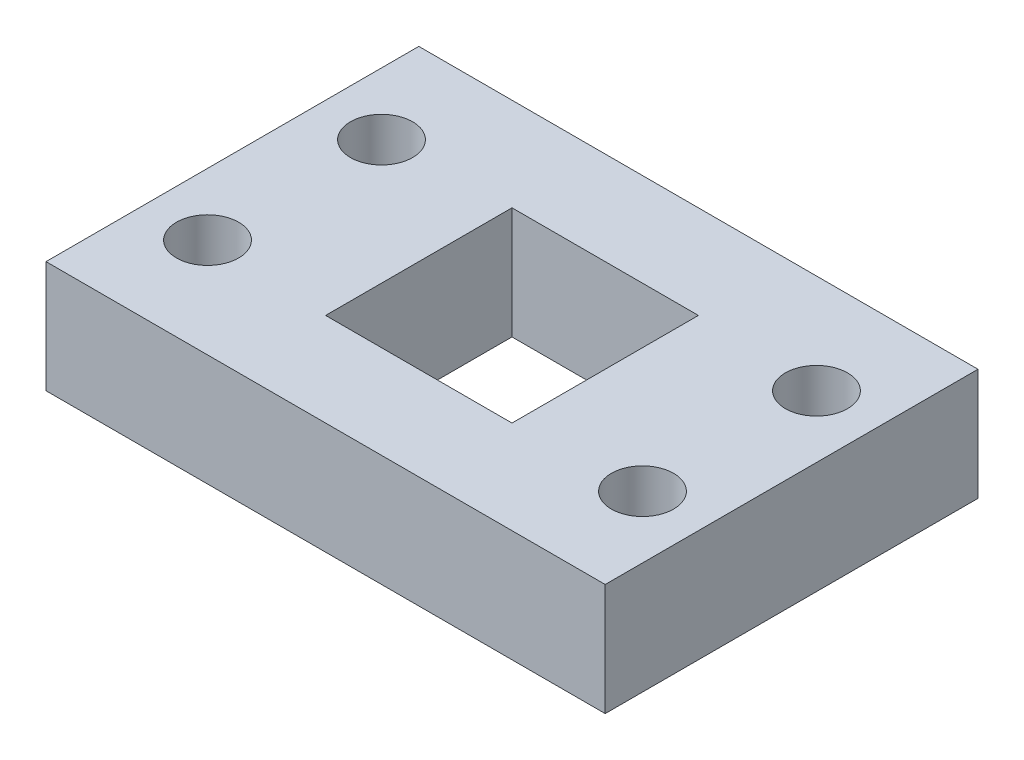
ISO-10303-21;
HEADER;
FILE_DESCRIPTION(('STEP AP214'),'2;1');
FILE_NAME('part.step','',(''),(''),'','','');
FILE_SCHEMA(('AUTOMOTIVE_DESIGN { 1 0 10303 214 1 1 1 1 }'));
ENDSEC;
DATA;
#1=APPLICATION_CONTEXT('core data for automotive mechanical design processes');
#2=APPLICATION_PROTOCOL_DEFINITION('international standard','automotive_design',2000,#1);
#3=PRODUCT_CONTEXT('',#1,'mechanical');
#4=PRODUCT('Part','Part','',(#3));
#5=PRODUCT_RELATED_PRODUCT_CATEGORY('part','',(#4));
#6=PRODUCT_DEFINITION_FORMATION('','',#4);
#7=PRODUCT_DEFINITION_CONTEXT('part definition',#1,'design');
#8=PRODUCT_DEFINITION('design','',#6,#7);
#9=PRODUCT_DEFINITION_SHAPE('','',#8);
#10=(LENGTH_UNIT() NAMED_UNIT(*) SI_UNIT(.MILLI.,.METRE.));
#11=(NAMED_UNIT(*) PLANE_ANGLE_UNIT() SI_UNIT($,.RADIAN.));
#12=(NAMED_UNIT(*) SI_UNIT($,.STERADIAN.) SOLID_ANGLE_UNIT());
#13=UNCERTAINTY_MEASURE_WITH_UNIT(LENGTH_MEASURE(1.E-05),#10,'distance_accuracy_value','');
#14=(GEOMETRIC_REPRESENTATION_CONTEXT(3) GLOBAL_UNCERTAINTY_ASSIGNED_CONTEXT((#13)) GLOBAL_UNIT_ASSIGNED_CONTEXT((#10,
#11,#12)) REPRESENTATION_CONTEXT('',''));
#15=CARTESIAN_POINT('',(0.,0.,0.));
#16=DIRECTION('',(0.,0.,1.));
#17=DIRECTION('',(1.,0.,0.));
#18=AXIS2_PLACEMENT_3D('',#15,#16,#17);
#19=CARTESIAN_POINT('',(0.,9.,0.));
#20=DIRECTION('',(1.,0.,0.));
#21=DIRECTION('',(0.,0.,-1.));
#22=AXIS2_PLACEMENT_3D('',#19,#20,#21);
#23=PLANE('',#22);
#24=DIRECTION('',(0.,0.,1.));
#25=VECTOR('',#24,1.);
#26=CARTESIAN_POINT('',(0.,0.,0.));
#27=LINE('',#26,#25);
#28=CARTESIAN_POINT('',(0.,0.,-30.));
#29=VERTEX_POINT('',#28);
#30=CARTESIAN_POINT('',(0.,0.,0.));
#31=VERTEX_POINT('',#30);
#32=EDGE_CURVE('E148',#29,#31,#27,.T.);
#33=ORIENTED_EDGE('',*,*,#32,.T.);
#34=DIRECTION('',(0.,-1.,0.));
#35=VECTOR('',#34,1.);
#36=CARTESIAN_POINT('',(0.,9.,0.));
#37=LINE('',#36,#35);
#38=CARTESIAN_POINT('',(0.,9.,0.));
#39=VERTEX_POINT('',#38);
#40=EDGE_CURVE('E164',#39,#31,#37,.T.);
#41=ORIENTED_EDGE('',*,*,#40,.F.);
#42=DIRECTION('',(0.,0.,1.));
#43=VECTOR('',#42,1.);
#44=CARTESIAN_POINT('',(0.,9.,0.));
#45=LINE('',#44,#43);
#46=CARTESIAN_POINT('',(0.,9.,-30.));
#47=VERTEX_POINT('',#46);
#48=EDGE_CURVE('E137',#47,#39,#45,.T.);
#49=ORIENTED_EDGE('',*,*,#48,.F.);
#50=DIRECTION('',(0.,-1.,0.));
#51=VECTOR('',#50,1.);
#52=CARTESIAN_POINT('',(0.,9.,-30.));
#53=LINE('',#52,#51);
#54=EDGE_CURVE('E147',#47,#29,#53,.T.);
#55=ORIENTED_EDGE('',*,*,#54,.T.);
#56=EDGE_LOOP('',(#33,#41,#49,#55));
#57=FACE_BOUND('',#56,.T.);
#58=ADVANCED_FACE('F33',(#57),#23,.F.);
#59=CARTESIAN_POINT('',(0.,9.,0.));
#60=DIRECTION('',(0.,0.,-1.));
#61=DIRECTION('',(-1.,0.,0.));
#62=AXIS2_PLACEMENT_3D('',#59,#60,#61);
#63=PLANE('',#62);
#64=DIRECTION('',(1.,0.,0.));
#65=VECTOR('',#64,1.);
#66=CARTESIAN_POINT('',(0.,0.,0.));
#67=LINE('',#66,#65);
#68=CARTESIAN_POINT('',(45.,0.,0.));
#69=VERTEX_POINT('',#68);
#70=EDGE_CURVE('E151',#31,#69,#67,.T.);
#71=ORIENTED_EDGE('',*,*,#70,.T.);
#72=DIRECTION('',(0.,-1.,0.));
#73=VECTOR('',#72,1.);
#74=CARTESIAN_POINT('',(45.,9.,0.));
#75=LINE('',#74,#73);
#76=CARTESIAN_POINT('',(45.,9.,0.));
#77=VERTEX_POINT('',#76);
#78=EDGE_CURVE('E161',#77,#69,#75,.T.);
#79=ORIENTED_EDGE('',*,*,#78,.F.);
#80=DIRECTION('',(1.,0.,0.));
#81=VECTOR('',#80,1.);
#82=CARTESIAN_POINT('',(0.,9.,0.));
#83=LINE('',#82,#81);
#84=EDGE_CURVE('E140',#39,#77,#83,.T.);
#85=ORIENTED_EDGE('',*,*,#84,.F.);
#86=ORIENTED_EDGE('',*,*,#40,.T.);
#87=EDGE_LOOP('',(#71,#79,#85,#86));
#88=FACE_BOUND('',#87,.T.);
#89=ADVANCED_FACE('F214',(#88),#63,.F.);
#90=CARTESIAN_POINT('',(45.,9.,0.));
#91=DIRECTION('',(-1.,0.,0.));
#92=DIRECTION('',(0.,0.,1.));
#93=AXIS2_PLACEMENT_3D('',#90,#91,#92);
#94=PLANE('',#93);
#95=DIRECTION('',(0.,0.,-1.));
#96=VECTOR('',#95,1.);
#97=CARTESIAN_POINT('',(45.,0.,0.));
#98=LINE('',#97,#96);
#99=CARTESIAN_POINT('',(45.,0.,-30.));
#100=VERTEX_POINT('',#99);
#101=EDGE_CURVE('E153',#69,#100,#98,.T.);
#102=ORIENTED_EDGE('',*,*,#101,.T.);
#103=DIRECTION('',(0.,-1.,0.));
#104=VECTOR('',#103,1.);
#105=CARTESIAN_POINT('',(45.,9.,-30.));
#106=LINE('',#105,#104);
#107=CARTESIAN_POINT('',(45.,9.,-30.));
#108=VERTEX_POINT('',#107);
#109=EDGE_CURVE('E158',#108,#100,#106,.T.);
#110=ORIENTED_EDGE('',*,*,#109,.F.);
#111=DIRECTION('',(0.,0.,-1.));
#112=VECTOR('',#111,1.);
#113=CARTESIAN_POINT('',(45.,9.,0.));
#114=LINE('',#113,#112);
#115=EDGE_CURVE('E143',#77,#108,#114,.T.);
#116=ORIENTED_EDGE('',*,*,#115,.F.);
#117=ORIENTED_EDGE('',*,*,#78,.T.);
#118=EDGE_LOOP('',(#102,#110,#116,#117));
#119=FACE_BOUND('',#118,.T.);
#120=ADVANCED_FACE('F211',(#119),#94,.F.);
#121=CARTESIAN_POINT('',(0.,9.,-30.));
#122=DIRECTION('',(0.,0.,1.));
#123=DIRECTION('',(1.,0.,0.));
#124=AXIS2_PLACEMENT_3D('',#121,#122,#123);
#125=PLANE('',#124);
#126=DIRECTION('',(-1.,0.,0.));
#127=VECTOR('',#126,1.);
#128=CARTESIAN_POINT('',(0.,0.,-30.));
#129=LINE('',#128,#127);
#130=EDGE_CURVE('E141',#100,#29,#129,.T.);
#131=ORIENTED_EDGE('',*,*,#130,.T.);
#132=ORIENTED_EDGE('',*,*,#54,.F.);
#133=DIRECTION('',(-1.,0.,0.));
#134=VECTOR('',#133,1.);
#135=CARTESIAN_POINT('',(0.,9.,-30.));
#136=LINE('',#135,#134);
#137=EDGE_CURVE('E145',#108,#47,#136,.T.);
#138=ORIENTED_EDGE('',*,*,#137,.F.);
#139=ORIENTED_EDGE('',*,*,#109,.T.);
#140=EDGE_LOOP('',(#131,#132,#138,#139));
#141=FACE_BOUND('',#140,.T.);
#142=ADVANCED_FACE('F207',(#141),#125,.F.);
#143=CARTESIAN_POINT('',(0.,9.,0.));
#144=DIRECTION('',(0.,-1.,0.));
#145=DIRECTION('',(0.,0.,-1.));
#146=AXIS2_PLACEMENT_3D('',#143,#144,#145);
#147=PLANE('',#146);
#148=CARTESIAN_POINT('',(4.99999999999999,9.,-8.));
#149=DIRECTION('',(0.,1.,0.));
#150=DIRECTION('',(0.,0.,1.));
#151=AXIS2_PLACEMENT_3D('',#148,#149,#150);
#152=CIRCLE('',#151,2.5);
#153=CARTESIAN_POINT('',(4.99999999999999,9.,-5.5));
#154=VERTEX_POINT('',#153);
#155=EDGE_CURVE('E127',#154,#154,#152,.T.);
#156=ORIENTED_EDGE('',*,*,#155,.F.);
#157=EDGE_LOOP('',(#156));
#158=FACE_BOUND('',#157,.T.);
#159=CARTESIAN_POINT('',(40.,9.,-8.));
#160=DIRECTION('',(0.,1.,0.));
#161=DIRECTION('',(0.,0.,-1.));
#162=AXIS2_PLACEMENT_3D('',#159,#160,#161);
#163=CIRCLE('',#162,2.5);
#164=CARTESIAN_POINT('',(40.,9.,-10.5));
#165=VERTEX_POINT('',#164);
#166=EDGE_CURVE('E131',#165,#165,#163,.T.);
#167=ORIENTED_EDGE('',*,*,#166,.F.);
#168=EDGE_LOOP('',(#167));
#169=FACE_BOUND('',#168,.T.);
#170=CARTESIAN_POINT('',(40.,9.,-22.));
#171=DIRECTION('',(0.,1.,0.));
#172=DIRECTION('',(0.,0.,-1.));
#173=AXIS2_PLACEMENT_3D('',#170,#171,#172);
#174=CIRCLE('',#173,2.5);
#175=CARTESIAN_POINT('',(40.,9.,-24.5));
#176=VERTEX_POINT('',#175);
#177=EDGE_CURVE('E124',#176,#176,#174,.T.);
#178=ORIENTED_EDGE('',*,*,#177,.F.);
#179=EDGE_LOOP('',(#178));
#180=FACE_BOUND('',#179,.T.);
#181=DIRECTION('',(-1.,0.,0.));
#182=VECTOR('',#181,1.);
#183=CARTESIAN_POINT('',(15.,9.,-22.5));
#184=LINE('',#183,#182);
#185=CARTESIAN_POINT('',(30.,9.,-22.5));
#186=VERTEX_POINT('',#185);
#187=CARTESIAN_POINT('',(15.,9.,-22.5));
#188=VERTEX_POINT('',#187);
#189=EDGE_CURVE('E110',#186,#188,#184,.T.);
#190=ORIENTED_EDGE('',*,*,#189,.F.);
#191=DIRECTION('',(0.,0.,-1.));
#192=VECTOR('',#191,1.);
#193=CARTESIAN_POINT('',(30.,9.,-7.5));
#194=LINE('',#193,#192);
#195=CARTESIAN_POINT('',(30.,9.,-7.5));
#196=VERTEX_POINT('',#195);
#197=EDGE_CURVE('E49',#196,#186,#194,.T.);
#198=ORIENTED_EDGE('',*,*,#197,.F.);
#199=DIRECTION('',(1.,0.,0.));
#200=VECTOR('',#199,1.);
#201=CARTESIAN_POINT('',(15.,9.,-7.5));
#202=LINE('',#201,#200);
#203=CARTESIAN_POINT('',(15.,9.,-7.5));
#204=VERTEX_POINT('',#203);
#205=EDGE_CURVE('E117',#204,#196,#202,.T.);
#206=ORIENTED_EDGE('',*,*,#205,.F.);
#207=DIRECTION('',(0.,0.,1.));
#208=VECTOR('',#207,1.);
#209=CARTESIAN_POINT('',(15.,9.,-7.5));
#210=LINE('',#209,#208);
#211=EDGE_CURVE('E101',#188,#204,#210,.T.);
#212=ORIENTED_EDGE('',*,*,#211,.F.);
#213=EDGE_LOOP('',(#190,#198,#206,#212));
#214=FACE_BOUND('',#213,.T.);
#215=CARTESIAN_POINT('',(4.99999999999999,9.,-22.));
#216=DIRECTION('',(0.,1.,0.));
#217=DIRECTION('',(0.,0.,1.));
#218=AXIS2_PLACEMENT_3D('',#215,#216,#217);
#219=CIRCLE('',#218,2.5);
#220=CARTESIAN_POINT('',(4.99999999999999,9.,-19.5));
#221=VERTEX_POINT('',#220);
#222=EDGE_CURVE('E130',#221,#221,#219,.T.);
#223=ORIENTED_EDGE('',*,*,#222,.F.);
#224=EDGE_LOOP('',(#223));
#225=FACE_BOUND('',#224,.T.);
#226=ORIENTED_EDGE('',*,*,#48,.T.);
#227=ORIENTED_EDGE('',*,*,#84,.T.);
#228=ORIENTED_EDGE('',*,*,#115,.T.);
#229=ORIENTED_EDGE('',*,*,#137,.T.);
#230=EDGE_LOOP('',(#226,#227,#228,#229));
#231=FACE_BOUND('',#230,.T.);
#232=ADVANCED_FACE('F114',(#158,#169,#180,#214,#225,#231),#147,.F.);
#233=CARTESIAN_POINT('',(0.,0.,0.));
#234=DIRECTION('',(0.,-1.,0.));
#235=DIRECTION('',(0.,0.,-1.));
#236=AXIS2_PLACEMENT_3D('',#233,#234,#235);
#237=PLANE('',#236);
#238=CARTESIAN_POINT('',(4.99999999999999,0.,-8.));
#239=DIRECTION('',(0.,-1.,0.));
#240=DIRECTION('',(0.,0.,-1.));
#241=AXIS2_PLACEMENT_3D('',#238,#239,#240);
#242=CIRCLE('',#241,2.5);
#243=CARTESIAN_POINT('',(4.99999999999999,0.,-10.5));
#244=VERTEX_POINT('',#243);
#245=EDGE_CURVE('E36',#244,#244,#242,.T.);
#246=ORIENTED_EDGE('',*,*,#245,.F.);
#247=EDGE_LOOP('',(#246));
#248=FACE_BOUND('',#247,.T.);
#249=CARTESIAN_POINT('',(40.,0.,-8.));
#250=DIRECTION('',(0.,-1.,0.));
#251=DIRECTION('',(0.,0.,-1.));
#252=AXIS2_PLACEMENT_3D('',#249,#250,#251);
#253=CIRCLE('',#252,2.5);
#254=CARTESIAN_POINT('',(40.,0.,-10.5));
#255=VERTEX_POINT('',#254);
#256=EDGE_CURVE('E175',#255,#255,#253,.T.);
#257=ORIENTED_EDGE('',*,*,#256,.F.);
#258=EDGE_LOOP('',(#257));
#259=FACE_BOUND('',#258,.T.);
#260=CARTESIAN_POINT('',(40.,0.,-22.));
#261=DIRECTION('',(0.,-1.,0.));
#262=DIRECTION('',(0.,0.,-1.));
#263=AXIS2_PLACEMENT_3D('',#260,#261,#262);
#264=CIRCLE('',#263,2.5);
#265=CARTESIAN_POINT('',(40.,0.,-24.5));
#266=VERTEX_POINT('',#265);
#267=EDGE_CURVE('E170',#266,#266,#264,.T.);
#268=ORIENTED_EDGE('',*,*,#267,.F.);
#269=EDGE_LOOP('',(#268));
#270=FACE_BOUND('',#269,.T.);
#271=DIRECTION('',(0.,0.,1.));
#272=VECTOR('',#271,1.);
#273=CARTESIAN_POINT('',(30.,0.,0.));
#274=LINE('',#273,#272);
#275=CARTESIAN_POINT('',(30.,0.,-22.5));
#276=VERTEX_POINT('',#275);
#277=CARTESIAN_POINT('',(30.,0.,-7.5));
#278=VERTEX_POINT('',#277);
#279=EDGE_CURVE('E11',#276,#278,#274,.T.);
#280=ORIENTED_EDGE('',*,*,#279,.F.);
#281=DIRECTION('',(1.,0.,0.));
#282=VECTOR('',#281,1.);
#283=CARTESIAN_POINT('',(0.,0.,-22.5));
#284=LINE('',#283,#282);
#285=CARTESIAN_POINT('',(15.,0.,-22.5));
#286=VERTEX_POINT('',#285);
#287=EDGE_CURVE('E167',#286,#276,#284,.T.);
#288=ORIENTED_EDGE('',*,*,#287,.F.);
#289=DIRECTION('',(0.,0.,-1.));
#290=VECTOR('',#289,1.);
#291=CARTESIAN_POINT('',(15.,0.,0.));
#292=LINE('',#291,#290);
#293=CARTESIAN_POINT('',(15.,0.,-7.5));
#294=VERTEX_POINT('',#293);
#295=EDGE_CURVE('E104',#294,#286,#292,.T.);
#296=ORIENTED_EDGE('',*,*,#295,.F.);
#297=DIRECTION('',(-1.,0.,0.));
#298=VECTOR('',#297,1.);
#299=CARTESIAN_POINT('',(0.,0.,-7.5));
#300=LINE('',#299,#298);
#301=EDGE_CURVE('E41',#278,#294,#300,.T.);
#302=ORIENTED_EDGE('',*,*,#301,.F.);
#303=EDGE_LOOP('',(#280,#288,#296,#302));
#304=FACE_BOUND('',#303,.T.);
#305=CARTESIAN_POINT('',(4.99999999999999,0.,-22.));
#306=DIRECTION('',(0.,-1.,0.));
#307=DIRECTION('',(0.,0.,-1.));
#308=AXIS2_PLACEMENT_3D('',#305,#306,#307);
#309=CIRCLE('',#308,2.5);
#310=CARTESIAN_POINT('',(4.99999999999999,0.,-24.5));
#311=VERTEX_POINT('',#310);
#312=EDGE_CURVE('E136',#311,#311,#309,.T.);
#313=ORIENTED_EDGE('',*,*,#312,.F.);
#314=EDGE_LOOP('',(#313));
#315=FACE_BOUND('',#314,.T.);
#316=ORIENTED_EDGE('',*,*,#32,.F.);
#317=ORIENTED_EDGE('',*,*,#130,.F.);
#318=ORIENTED_EDGE('',*,*,#101,.F.);
#319=ORIENTED_EDGE('',*,*,#70,.F.);
#320=EDGE_LOOP('',(#316,#317,#318,#319));
#321=FACE_BOUND('',#320,.T.);
#322=ADVANCED_FACE('F185',(#248,#259,#270,#304,#315,#321),#237,.T.);
#323=CARTESIAN_POINT('',(4.99999999999999,-1.,-22.));
#324=DIRECTION('',(0.,1.,0.));
#325=DIRECTION('',(0.,0.,1.));
#326=AXIS2_PLACEMENT_3D('',#323,#324,#325);
#327=CYLINDRICAL_SURFACE('',#326,2.5);
#328=ORIENTED_EDGE('',*,*,#312,.T.);
#329=EDGE_LOOP('',(#328));
#330=FACE_BOUND('',#329,.T.);
#331=ORIENTED_EDGE('',*,*,#222,.T.);
#332=EDGE_LOOP('',(#331));
#333=FACE_BOUND('',#332,.T.);
#334=ADVANCED_FACE('F188',(#330,#333),#327,.F.);
#335=CARTESIAN_POINT('',(30.,-1.,-7.5));
#336=DIRECTION('',(1.,0.,0.));
#337=DIRECTION('',(0.,0.,-1.));
#338=AXIS2_PLACEMENT_3D('',#335,#336,#337);
#339=PLANE('',#338);
#340=ORIENTED_EDGE('',*,*,#279,.T.);
#341=DIRECTION('',(0.,1.,0.));
#342=VECTOR('',#341,1.);
#343=CARTESIAN_POINT('',(30.,-1.,-7.5));
#344=LINE('',#343,#342);
#345=EDGE_CURVE('E122',#278,#196,#344,.T.);
#346=ORIENTED_EDGE('',*,*,#345,.T.);
#347=ORIENTED_EDGE('',*,*,#197,.T.);
#348=DIRECTION('',(0.,1.,0.));
#349=VECTOR('',#348,1.);
#350=CARTESIAN_POINT('',(30.,-1.,-22.5));
#351=LINE('',#350,#349);
#352=EDGE_CURVE('E107',#276,#186,#351,.T.);
#353=ORIENTED_EDGE('',*,*,#352,.F.);
#354=EDGE_LOOP('',(#340,#346,#347,#353));
#355=FACE_BOUND('',#354,.T.);
#356=ADVANCED_FACE('F259',(#355),#339,.F.);
#357=CARTESIAN_POINT('',(15.,-1.,-7.5));
#358=DIRECTION('',(0.,0.,1.));
#359=DIRECTION('',(1.,0.,0.));
#360=AXIS2_PLACEMENT_3D('',#357,#358,#359);
#361=PLANE('',#360);
#362=ORIENTED_EDGE('',*,*,#301,.T.);
#363=DIRECTION('',(0.,1.,0.));
#364=VECTOR('',#363,1.);
#365=CARTESIAN_POINT('',(15.,-1.,-7.5));
#366=LINE('',#365,#364);
#367=EDGE_CURVE('E106',#294,#204,#366,.T.);
#368=ORIENTED_EDGE('',*,*,#367,.T.);
#369=ORIENTED_EDGE('',*,*,#205,.T.);
#370=ORIENTED_EDGE('',*,*,#345,.F.);
#371=EDGE_LOOP('',(#362,#368,#369,#370));
#372=FACE_BOUND('',#371,.T.);
#373=ADVANCED_FACE('F268',(#372),#361,.F.);
#374=CARTESIAN_POINT('',(15.,-1.,-7.5));
#375=DIRECTION('',(-1.,0.,0.));
#376=DIRECTION('',(0.,0.,1.));
#377=AXIS2_PLACEMENT_3D('',#374,#375,#376);
#378=PLANE('',#377);
#379=ORIENTED_EDGE('',*,*,#295,.T.);
#380=DIRECTION('',(0.,1.,0.));
#381=VECTOR('',#380,1.);
#382=CARTESIAN_POINT('',(15.,-1.,-22.5));
#383=LINE('',#382,#381);
#384=EDGE_CURVE('E57',#286,#188,#383,.T.);
#385=ORIENTED_EDGE('',*,*,#384,.T.);
#386=ORIENTED_EDGE('',*,*,#211,.T.);
#387=ORIENTED_EDGE('',*,*,#367,.F.);
#388=EDGE_LOOP('',(#379,#385,#386,#387));
#389=FACE_BOUND('',#388,.T.);
#390=ADVANCED_FACE('F98',(#389),#378,.F.);
#391=CARTESIAN_POINT('',(15.,-1.,-22.5));
#392=DIRECTION('',(0.,0.,-1.));
#393=DIRECTION('',(-1.,0.,0.));
#394=AXIS2_PLACEMENT_3D('',#391,#392,#393);
#395=PLANE('',#394);
#396=ORIENTED_EDGE('',*,*,#287,.T.);
#397=ORIENTED_EDGE('',*,*,#352,.T.);
#398=ORIENTED_EDGE('',*,*,#189,.T.);
#399=ORIENTED_EDGE('',*,*,#384,.F.);
#400=EDGE_LOOP('',(#396,#397,#398,#399));
#401=FACE_BOUND('',#400,.T.);
#402=ADVANCED_FACE('F111',(#401),#395,.F.);
#403=CARTESIAN_POINT('',(40.,-1.,-22.));
#404=DIRECTION('',(0.,1.,0.));
#405=DIRECTION('',(0.,0.,1.));
#406=AXIS2_PLACEMENT_3D('',#403,#404,#405);
#407=CYLINDRICAL_SURFACE('',#406,2.5);
#408=ORIENTED_EDGE('',*,*,#267,.T.);
#409=EDGE_LOOP('',(#408));
#410=FACE_BOUND('',#409,.T.);
#411=ORIENTED_EDGE('',*,*,#177,.T.);
#412=EDGE_LOOP('',(#411));
#413=FACE_BOUND('',#412,.T.);
#414=ADVANCED_FACE('F294',(#410,#413),#407,.F.);
#415=CARTESIAN_POINT('',(40.,-1.,-8.));
#416=DIRECTION('',(0.,1.,0.));
#417=DIRECTION('',(0.,0.,1.));
#418=AXIS2_PLACEMENT_3D('',#415,#416,#417);
#419=CYLINDRICAL_SURFACE('',#418,2.5);
#420=ORIENTED_EDGE('',*,*,#256,.T.);
#421=EDGE_LOOP('',(#420));
#422=FACE_BOUND('',#421,.T.);
#423=ORIENTED_EDGE('',*,*,#166,.T.);
#424=EDGE_LOOP('',(#423));
#425=FACE_BOUND('',#424,.T.);
#426=ADVANCED_FACE('F303',(#422,#425),#419,.F.);
#427=CARTESIAN_POINT('',(4.99999999999999,-1.,-8.));
#428=DIRECTION('',(0.,1.,0.));
#429=DIRECTION('',(0.,0.,1.));
#430=AXIS2_PLACEMENT_3D('',#427,#428,#429);
#431=CYLINDRICAL_SURFACE('',#430,2.5);
#432=ORIENTED_EDGE('',*,*,#245,.T.);
#433=EDGE_LOOP('',(#432));
#434=FACE_BOUND('',#433,.T.);
#435=ORIENTED_EDGE('',*,*,#155,.T.);
#436=EDGE_LOOP('',(#435));
#437=FACE_BOUND('',#436,.T.);
#438=ADVANCED_FACE('F182',(#434,#437),#431,.F.);
#439=CLOSED_SHELL('',(#58,#89,#120,#142,#232,#322,#334,#356,#373,#390,#402,#414,#426,#438));
#440=MANIFOLD_SOLID_BREP('B2',#439);
#441=ADVANCED_BREP_SHAPE_REPRESENTATION('',(#18,#440),#14);
#442=SHAPE_DEFINITION_REPRESENTATION(#9,#441);
ENDSEC;
END-ISO-10303-21;
